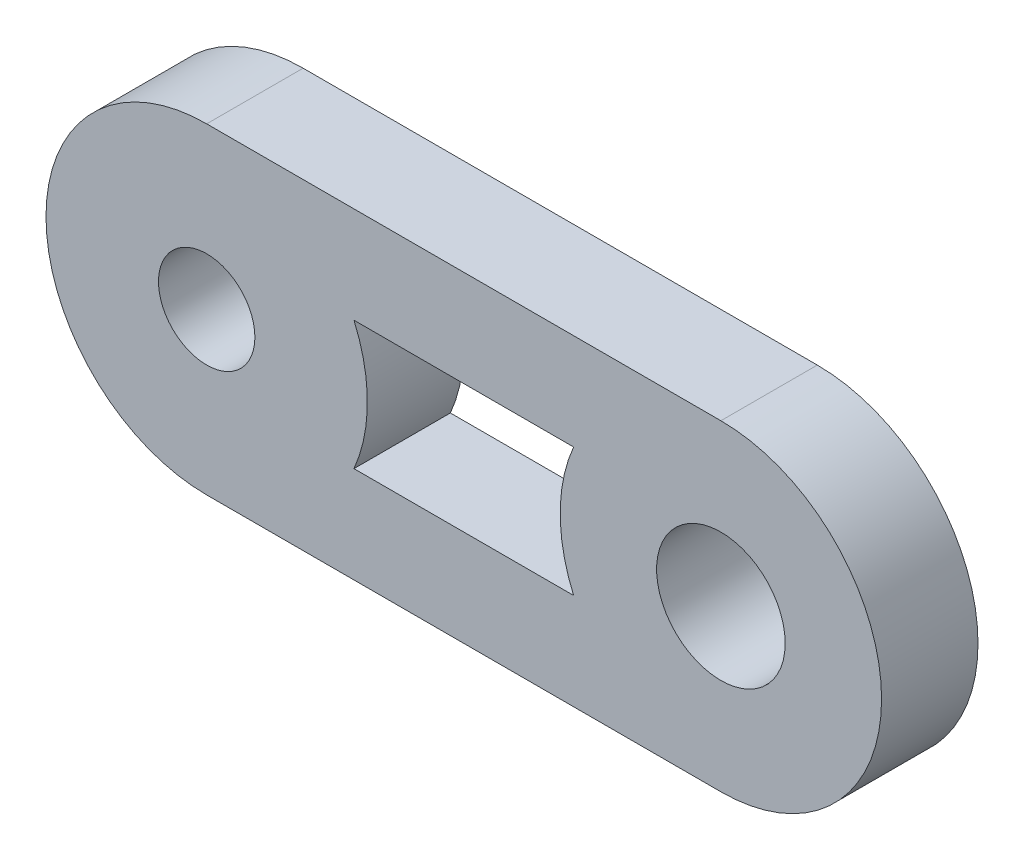
ISO-10303-21;
HEADER;
FILE_DESCRIPTION(('STEP AP214'),'2;1');
FILE_NAME('part.step','',(''),(''),'','','');
FILE_SCHEMA(('AUTOMOTIVE_DESIGN { 1 0 10303 214 1 1 1 1 }'));
ENDSEC;
DATA;
#1=APPLICATION_CONTEXT('core data for automotive mechanical design processes');
#2=APPLICATION_PROTOCOL_DEFINITION('international standard','automotive_design',2000,#1);
#3=PRODUCT_CONTEXT('',#1,'mechanical');
#4=PRODUCT('Part','Part','',(#3));
#5=PRODUCT_RELATED_PRODUCT_CATEGORY('part','',(#4));
#6=PRODUCT_DEFINITION_FORMATION('','',#4);
#7=PRODUCT_DEFINITION_CONTEXT('part definition',#1,'design');
#8=PRODUCT_DEFINITION('design','',#6,#7);
#9=PRODUCT_DEFINITION_SHAPE('','',#8);
#10=(LENGTH_UNIT() NAMED_UNIT(*) SI_UNIT(.MILLI.,.METRE.));
#11=(NAMED_UNIT(*) PLANE_ANGLE_UNIT() SI_UNIT($,.RADIAN.));
#12=(NAMED_UNIT(*) SI_UNIT($,.STERADIAN.) SOLID_ANGLE_UNIT());
#13=UNCERTAINTY_MEASURE_WITH_UNIT(LENGTH_MEASURE(1.E-05),#10,'distance_accuracy_value','');
#14=(GEOMETRIC_REPRESENTATION_CONTEXT(3) GLOBAL_UNCERTAINTY_ASSIGNED_CONTEXT((#13)) GLOBAL_UNIT_ASSIGNED_CONTEXT((#10,
#11,#12)) REPRESENTATION_CONTEXT('',''));
#15=CARTESIAN_POINT('',(0.,0.,0.));
#16=DIRECTION('',(0.,0.,1.));
#17=DIRECTION('',(1.,0.,0.));
#18=AXIS2_PLACEMENT_3D('',#15,#16,#17);
#19=CARTESIAN_POINT('',(7.99999999999999,-5.,-3.));
#20=DIRECTION('',(0.,1.,0.));
#21=DIRECTION('',(0.,0.,-1.));
#22=AXIS2_PLACEMENT_3D('',#19,#20,#21);
#23=PLANE('',#22);
#24=DIRECTION('',(1.,0.,0.));
#25=VECTOR('',#24,1.);
#26=CARTESIAN_POINT('',(7.99999999999999,-5.,0.));
#27=LINE('',#26,#25);
#28=CARTESIAN_POINT('',(0.,-5.,0.));
#29=VERTEX_POINT('',#28);
#30=CARTESIAN_POINT('',(15.9999999999999,-5.,0.));
#31=VERTEX_POINT('',#30);
#32=EDGE_CURVE('E146',#29,#31,#27,.T.);
#33=ORIENTED_EDGE('',*,*,#32,.F.);
#34=DIRECTION('',(0.,0.,1.));
#35=VECTOR('',#34,1.);
#36=CARTESIAN_POINT('',(0.,-5.,-3.));
#37=LINE('',#36,#35);
#38=CARTESIAN_POINT('',(0.,-5.,-3.));
#39=VERTEX_POINT('',#38);
#40=EDGE_CURVE('E143',#39,#29,#37,.T.);
#41=ORIENTED_EDGE('',*,*,#40,.F.);
#42=DIRECTION('',(1.,0.,0.));
#43=VECTOR('',#42,1.);
#44=CARTESIAN_POINT('',(7.99999999999999,-5.,-3.));
#45=LINE('',#44,#43);
#46=CARTESIAN_POINT('',(15.9999999999999,-5.,-3.));
#47=VERTEX_POINT('',#46);
#48=EDGE_CURVE('E132',#39,#47,#45,.T.);
#49=ORIENTED_EDGE('',*,*,#48,.T.);
#50=DIRECTION('',(0.,0.,1.));
#51=VECTOR('',#50,1.);
#52=CARTESIAN_POINT('',(15.9999999999999,-5.,-3.));
#53=LINE('',#52,#51);
#54=EDGE_CURVE('E163',#47,#31,#53,.T.);
#55=ORIENTED_EDGE('',*,*,#54,.T.);
#56=EDGE_LOOP('',(#33,#41,#49,#55));
#57=FACE_BOUND('',#56,.T.);
#58=ADVANCED_FACE('F34',(#57),#23,.F.);
#59=CARTESIAN_POINT('',(16.,0.,-3.));
#60=DIRECTION('',(0.,0.,1.));
#61=DIRECTION('',(-1.,0.,0.));
#62=AXIS2_PLACEMENT_3D('',#59,#60,#61);
#63=CYLINDRICAL_SURFACE('',#62,5.);
#64=CARTESIAN_POINT('',(16.,0.,0.));
#65=DIRECTION('',(0.,0.,1.));
#66=DIRECTION('',(1.,0.,0.));
#67=AXIS2_PLACEMENT_3D('',#64,#65,#66);
#68=CIRCLE('',#67,5.);
#69=CARTESIAN_POINT('',(15.9999999999999,5.,0.));
#70=VERTEX_POINT('',#69);
#71=EDGE_CURVE('E149',#31,#70,#68,.T.);
#72=ORIENTED_EDGE('',*,*,#71,.F.);
#73=ORIENTED_EDGE('',*,*,#54,.F.);
#74=CARTESIAN_POINT('',(16.,0.,-3.));
#75=DIRECTION('',(0.,0.,1.));
#76=DIRECTION('',(1.,0.,0.));
#77=AXIS2_PLACEMENT_3D('',#74,#75,#76);
#78=CIRCLE('',#77,5.);
#79=CARTESIAN_POINT('',(15.9999999999999,5.,-3.));
#80=VERTEX_POINT('',#79);
#81=EDGE_CURVE('E136',#47,#80,#78,.T.);
#82=ORIENTED_EDGE('',*,*,#81,.T.);
#83=DIRECTION('',(0.,0.,1.));
#84=VECTOR('',#83,1.);
#85=CARTESIAN_POINT('',(15.9999999999999,5.,-3.));
#86=LINE('',#85,#84);
#87=EDGE_CURVE('E160',#80,#70,#86,.T.);
#88=ORIENTED_EDGE('',*,*,#87,.T.);
#89=EDGE_LOOP('',(#72,#73,#82,#88));
#90=FACE_BOUND('',#89,.T.);
#91=ADVANCED_FACE('F190',(#90),#63,.T.);
#92=CARTESIAN_POINT('',(7.99999999999999,5.,-3.));
#93=DIRECTION('',(0.,1.,0.));
#94=DIRECTION('',(0.,0.,-1.));
#95=AXIS2_PLACEMENT_3D('',#92,#93,#94);
#96=PLANE('',#95);
#97=DIRECTION('',(1.,0.,0.));
#98=VECTOR('',#97,1.);
#99=CARTESIAN_POINT('',(7.99999999999999,5.,0.));
#100=LINE('',#99,#98);
#101=CARTESIAN_POINT('',(0.,5.,0.));
#102=VERTEX_POINT('',#101);
#103=EDGE_CURVE('E152',#102,#70,#100,.T.);
#104=ORIENTED_EDGE('',*,*,#103,.T.);
#105=ORIENTED_EDGE('',*,*,#87,.F.);
#106=DIRECTION('',(1.,0.,0.));
#107=VECTOR('',#106,1.);
#108=CARTESIAN_POINT('',(7.99999999999999,5.,-3.));
#109=LINE('',#108,#107);
#110=CARTESIAN_POINT('',(0.,5.,-3.));
#111=VERTEX_POINT('',#110);
#112=EDGE_CURVE('E139',#111,#80,#109,.T.);
#113=ORIENTED_EDGE('',*,*,#112,.F.);
#114=DIRECTION('',(0.,0.,1.));
#115=VECTOR('',#114,1.);
#116=CARTESIAN_POINT('',(0.,5.,-3.));
#117=LINE('',#116,#115);
#118=EDGE_CURVE('E157',#111,#102,#117,.T.);
#119=ORIENTED_EDGE('',*,*,#118,.T.);
#120=EDGE_LOOP('',(#104,#105,#113,#119));
#121=FACE_BOUND('',#120,.T.);
#122=ADVANCED_FACE('F195',(#121),#96,.T.);
#123=CARTESIAN_POINT('',(0.,0.,-3.));
#124=DIRECTION('',(0.,0.,1.));
#125=DIRECTION('',(-1.,0.,0.));
#126=AXIS2_PLACEMENT_3D('',#123,#124,#125);
#127=CYLINDRICAL_SURFACE('',#126,1.5);
#128=CARTESIAN_POINT('',(0.,0.,-3.));
#129=DIRECTION('',(0.,0.,1.));
#130=DIRECTION('',(1.,0.,0.));
#131=AXIS2_PLACEMENT_3D('',#128,#129,#130);
#132=CIRCLE('',#131,1.5);
#133=CARTESIAN_POINT('',(1.5,0.,-3.));
#134=VERTEX_POINT('',#133);
#135=EDGE_CURVE('E129',#134,#134,#132,.T.);
#136=ORIENTED_EDGE('',*,*,#135,.F.);
#137=EDGE_LOOP('',(#136));
#138=FACE_BOUND('',#137,.T.);
#139=CARTESIAN_POINT('',(0.,0.,0.));
#140=DIRECTION('',(0.,0.,1.));
#141=DIRECTION('',(1.,0.,0.));
#142=AXIS2_PLACEMENT_3D('',#139,#140,#141);
#143=CIRCLE('',#142,1.5);
#144=CARTESIAN_POINT('',(1.5,0.,0.));
#145=VERTEX_POINT('',#144);
#146=EDGE_CURVE('E126',#145,#145,#143,.T.);
#147=ORIENTED_EDGE('',*,*,#146,.T.);
#148=EDGE_LOOP('',(#147));
#149=FACE_BOUND('',#148,.T.);
#150=ADVANCED_FACE('F36',(#138,#149),#127,.F.);
#151=CARTESIAN_POINT('',(0.,0.,-3.));
#152=DIRECTION('',(0.,0.,1.));
#153=DIRECTION('',(-1.,0.,0.));
#154=AXIS2_PLACEMENT_3D('',#151,#152,#153);
#155=CYLINDRICAL_SURFACE('',#154,5.);
#156=CARTESIAN_POINT('',(0.,0.,0.));
#157=DIRECTION('',(0.,0.,1.));
#158=DIRECTION('',(1.,0.,0.));
#159=AXIS2_PLACEMENT_3D('',#156,#157,#158);
#160=CIRCLE('',#159,5.);
#161=EDGE_CURVE('E133',#29,#102,#160,.F.);
#162=ORIENTED_EDGE('',*,*,#161,.T.);
#163=ORIENTED_EDGE('',*,*,#118,.F.);
#164=CARTESIAN_POINT('',(0.,0.,-3.));
#165=DIRECTION('',(0.,0.,1.));
#166=DIRECTION('',(1.,0.,0.));
#167=AXIS2_PLACEMENT_3D('',#164,#165,#166);
#168=CIRCLE('',#167,5.);
#169=EDGE_CURVE('E141',#39,#111,#168,.F.);
#170=ORIENTED_EDGE('',*,*,#169,.F.);
#171=ORIENTED_EDGE('',*,*,#40,.T.);
#172=EDGE_LOOP('',(#162,#163,#170,#171));
#173=FACE_BOUND('',#172,.T.);
#174=ADVANCED_FACE('F203',(#173),#155,.T.);
#175=CARTESIAN_POINT('',(7.99999999999999,-21.8089085201887,-3.));
#176=DIRECTION('',(0.,0.,-1.));
#177=DIRECTION('',(1.,0.,0.));
#178=AXIS2_PLACEMENT_3D('',#175,#176,#177);
#179=PLANE('',#178);
#180=CARTESIAN_POINT('',(16.,0.,-3.));
#181=DIRECTION('',(0.,0.,1.));
#182=DIRECTION('',(1.,0.,0.));
#183=AXIS2_PLACEMENT_3D('',#180,#181,#182);
#184=CIRCLE('',#183,2.);
#185=CARTESIAN_POINT('',(18.,0.,-3.));
#186=VERTEX_POINT('',#185);
#187=EDGE_CURVE('E212',#186,#186,#184,.T.);
#188=ORIENTED_EDGE('',*,*,#187,.T.);
#189=EDGE_LOOP('',(#188));
#190=FACE_BOUND('',#189,.T.);
#191=CARTESIAN_POINT('',(16.,0.,-3.));
#192=DIRECTION('',(0.,0.,-1.));
#193=DIRECTION('',(1.,0.,0.));
#194=AXIS2_PLACEMENT_3D('',#191,#192,#193);
#195=CIRCLE('',#194,5.);
#196=CARTESIAN_POINT('',(11.4174243050441,-2.,-3.));
#197=VERTEX_POINT('',#196);
#198=CARTESIAN_POINT('',(11.4174243050441,2.,-3.));
#199=VERTEX_POINT('',#198);
#200=EDGE_CURVE('E118',#197,#199,#195,.T.);
#201=ORIENTED_EDGE('',*,*,#200,.T.);
#202=DIRECTION('',(-1.,0.,0.));
#203=VECTOR('',#202,1.);
#204=CARTESIAN_POINT('',(11.4174243050441,2.,-3.));
#205=LINE('',#204,#203);
#206=CARTESIAN_POINT('',(4.58257569495584,2.,-3.));
#207=VERTEX_POINT('',#206);
#208=EDGE_CURVE('E101',#199,#207,#205,.T.);
#209=ORIENTED_EDGE('',*,*,#208,.T.);
#210=CARTESIAN_POINT('',(0.,0.,-3.));
#211=DIRECTION('',(0.,0.,-1.));
#212=DIRECTION('',(1.,0.,0.));
#213=AXIS2_PLACEMENT_3D('',#210,#211,#212);
#214=CIRCLE('',#213,5.);
#215=CARTESIAN_POINT('',(4.58257569495584,-2.,-3.));
#216=VERTEX_POINT('',#215);
#217=EDGE_CURVE('E109',#207,#216,#214,.T.);
#218=ORIENTED_EDGE('',*,*,#217,.T.);
#219=DIRECTION('',(1.,0.,0.));
#220=VECTOR('',#219,1.);
#221=CARTESIAN_POINT('',(4.58257569495584,-2.,-3.));
#222=LINE('',#221,#220);
#223=EDGE_CURVE('E114',#216,#197,#222,.T.);
#224=ORIENTED_EDGE('',*,*,#223,.T.);
#225=EDGE_LOOP('',(#201,#209,#218,#224));
#226=FACE_BOUND('',#225,.T.);
#227=ORIENTED_EDGE('',*,*,#135,.T.);
#228=EDGE_LOOP('',(#227));
#229=FACE_BOUND('',#228,.T.);
#230=ORIENTED_EDGE('',*,*,#48,.F.);
#231=ORIENTED_EDGE('',*,*,#169,.T.);
#232=ORIENTED_EDGE('',*,*,#112,.T.);
#233=ORIENTED_EDGE('',*,*,#81,.F.);
#234=EDGE_LOOP('',(#230,#231,#232,#233));
#235=FACE_BOUND('',#234,.T.);
#236=ADVANCED_FACE('F116',(#190,#226,#229,#235),#179,.T.);
#237=CARTESIAN_POINT('',(7.99999999999999,-21.8089085201887,0.));
#238=DIRECTION('',(0.,0.,-1.));
#239=DIRECTION('',(1.,0.,0.));
#240=AXIS2_PLACEMENT_3D('',#237,#238,#239);
#241=PLANE('',#240);
#242=CARTESIAN_POINT('',(16.,0.,0.));
#243=DIRECTION('',(0.,0.,1.));
#244=DIRECTION('',(1.,0.,0.));
#245=AXIS2_PLACEMENT_3D('',#242,#243,#244);
#246=CIRCLE('',#245,2.);
#247=CARTESIAN_POINT('',(18.,0.,0.));
#248=VERTEX_POINT('',#247);
#249=EDGE_CURVE('E38',#248,#248,#246,.T.);
#250=ORIENTED_EDGE('',*,*,#249,.F.);
#251=EDGE_LOOP('',(#250));
#252=FACE_BOUND('',#251,.T.);
#253=DIRECTION('',(1.,0.,0.));
#254=VECTOR('',#253,1.);
#255=CARTESIAN_POINT('',(7.99999999999999,-2.,0.));
#256=LINE('',#255,#254);
#257=CARTESIAN_POINT('',(4.58257569495584,-2.,0.));
#258=VERTEX_POINT('',#257);
#259=CARTESIAN_POINT('',(11.4174243050441,-2.,0.));
#260=VERTEX_POINT('',#259);
#261=EDGE_CURVE('E43',#258,#260,#256,.T.);
#262=ORIENTED_EDGE('',*,*,#261,.F.);
#263=CARTESIAN_POINT('',(0.,0.,0.));
#264=DIRECTION('',(0.,0.,1.));
#265=DIRECTION('',(1.,0.,0.));
#266=AXIS2_PLACEMENT_3D('',#263,#264,#265);
#267=CIRCLE('',#266,5.);
#268=CARTESIAN_POINT('',(4.58257569495584,2.,0.));
#269=VERTEX_POINT('',#268);
#270=EDGE_CURVE('E167',#269,#258,#267,.F.);
#271=ORIENTED_EDGE('',*,*,#270,.F.);
#272=DIRECTION('',(-1.,0.,0.));
#273=VECTOR('',#272,1.);
#274=CARTESIAN_POINT('',(7.99999999999999,2.,0.));
#275=LINE('',#274,#273);
#276=CARTESIAN_POINT('',(11.4174243050441,2.,0.));
#277=VERTEX_POINT('',#276);
#278=EDGE_CURVE('E104',#277,#269,#275,.T.);
#279=ORIENTED_EDGE('',*,*,#278,.F.);
#280=CARTESIAN_POINT('',(16.,0.,0.));
#281=DIRECTION('',(0.,0.,1.));
#282=DIRECTION('',(1.,0.,0.));
#283=AXIS2_PLACEMENT_3D('',#280,#281,#282);
#284=CIRCLE('',#283,5.);
#285=EDGE_CURVE('E11',#260,#277,#284,.F.);
#286=ORIENTED_EDGE('',*,*,#285,.F.);
#287=EDGE_LOOP('',(#262,#271,#279,#286));
#288=FACE_BOUND('',#287,.T.);
#289=ORIENTED_EDGE('',*,*,#146,.F.);
#290=EDGE_LOOP('',(#289));
#291=FACE_BOUND('',#290,.T.);
#292=ORIENTED_EDGE('',*,*,#32,.T.);
#293=ORIENTED_EDGE('',*,*,#71,.T.);
#294=ORIENTED_EDGE('',*,*,#103,.F.);
#295=ORIENTED_EDGE('',*,*,#161,.F.);
#296=EDGE_LOOP('',(#292,#293,#294,#295));
#297=FACE_BOUND('',#296,.T.);
#298=ADVANCED_FACE('F175',(#252,#288,#291,#297),#241,.F.);
#299=CARTESIAN_POINT('',(16.,0.,7.));
#300=DIRECTION('',(0.,0.,-1.));
#301=DIRECTION('',(1.,0.,0.));
#302=AXIS2_PLACEMENT_3D('',#299,#300,#301);
#303=CYLINDRICAL_SURFACE('',#302,5.);
#304=DIRECTION('',(0.,0.,-1.));
#305=VECTOR('',#304,1.);
#306=CARTESIAN_POINT('',(11.4174243050441,-2.,7.));
#307=LINE('',#306,#305);
#308=EDGE_CURVE('E124',#260,#197,#307,.T.);
#309=ORIENTED_EDGE('',*,*,#308,.F.);
#310=ORIENTED_EDGE('',*,*,#285,.T.);
#311=DIRECTION('',(0.,0.,-1.));
#312=VECTOR('',#311,1.);
#313=CARTESIAN_POINT('',(11.4174243050441,2.,7.));
#314=LINE('',#313,#312);
#315=EDGE_CURVE('E49',#277,#199,#314,.T.);
#316=ORIENTED_EDGE('',*,*,#315,.T.);
#317=ORIENTED_EDGE('',*,*,#200,.F.);
#318=EDGE_LOOP('',(#309,#310,#316,#317));
#319=FACE_BOUND('',#318,.T.);
#320=ADVANCED_FACE('F177',(#319),#303,.T.);
#321=CARTESIAN_POINT('',(4.58257569495584,-2.,7.));
#322=DIRECTION('',(0.,-1.,0.));
#323=DIRECTION('',(0.,0.,1.));
#324=AXIS2_PLACEMENT_3D('',#321,#322,#323);
#325=PLANE('',#324);
#326=DIRECTION('',(0.,0.,-1.));
#327=VECTOR('',#326,1.);
#328=CARTESIAN_POINT('',(4.58257569495584,-2.,7.));
#329=LINE('',#328,#327);
#330=EDGE_CURVE('E106',#258,#216,#329,.T.);
#331=ORIENTED_EDGE('',*,*,#330,.F.);
#332=ORIENTED_EDGE('',*,*,#261,.T.);
#333=ORIENTED_EDGE('',*,*,#308,.T.);
#334=ORIENTED_EDGE('',*,*,#223,.F.);
#335=EDGE_LOOP('',(#331,#332,#333,#334));
#336=FACE_BOUND('',#335,.T.);
#337=ADVANCED_FACE('F172',(#336),#325,.F.);
#338=CARTESIAN_POINT('',(0.,0.,7.));
#339=DIRECTION('',(0.,0.,-1.));
#340=DIRECTION('',(1.,0.,0.));
#341=AXIS2_PLACEMENT_3D('',#338,#339,#340);
#342=CYLINDRICAL_SURFACE('',#341,5.);
#343=DIRECTION('',(0.,0.,-1.));
#344=VECTOR('',#343,1.);
#345=CARTESIAN_POINT('',(4.58257569495584,2.,7.));
#346=LINE('',#345,#344);
#347=EDGE_CURVE('E57',#269,#207,#346,.T.);
#348=ORIENTED_EDGE('',*,*,#347,.F.);
#349=ORIENTED_EDGE('',*,*,#270,.T.);
#350=ORIENTED_EDGE('',*,*,#330,.T.);
#351=ORIENTED_EDGE('',*,*,#217,.F.);
#352=EDGE_LOOP('',(#348,#349,#350,#351));
#353=FACE_BOUND('',#352,.T.);
#354=ADVANCED_FACE('F110',(#353),#342,.T.);
#355=CARTESIAN_POINT('',(11.4174243050441,2.,7.));
#356=DIRECTION('',(0.,1.,0.));
#357=DIRECTION('',(0.,0.,-1.));
#358=AXIS2_PLACEMENT_3D('',#355,#356,#357);
#359=PLANE('',#358);
#360=ORIENTED_EDGE('',*,*,#315,.F.);
#361=ORIENTED_EDGE('',*,*,#278,.T.);
#362=ORIENTED_EDGE('',*,*,#347,.T.);
#363=ORIENTED_EDGE('',*,*,#208,.F.);
#364=EDGE_LOOP('',(#360,#361,#362,#363));
#365=FACE_BOUND('',#364,.T.);
#366=ADVANCED_FACE('F99',(#365),#359,.F.);
#367=CARTESIAN_POINT('',(16.,0.,7.));
#368=DIRECTION('',(0.,0.,-1.));
#369=DIRECTION('',(1.,0.,0.));
#370=AXIS2_PLACEMENT_3D('',#367,#368,#369);
#371=CYLINDRICAL_SURFACE('',#370,2.);
#372=ORIENTED_EDGE('',*,*,#187,.F.);
#373=EDGE_LOOP('',(#372));
#374=FACE_BOUND('',#373,.T.);
#375=ORIENTED_EDGE('',*,*,#249,.T.);
#376=EDGE_LOOP('',(#375));
#377=FACE_BOUND('',#376,.T.);
#378=ADVANCED_FACE('F217',(#374,#377),#371,.F.);
#379=CLOSED_SHELL('',(#58,#91,#122,#150,#174,#236,#298,#320,#337,#354,#366,#378));
#380=MANIFOLD_SOLID_BREP('B2',#379);
#381=ADVANCED_BREP_SHAPE_REPRESENTATION('',(#18,#380),#14);
#382=SHAPE_DEFINITION_REPRESENTATION(#9,#381);
ENDSEC;
END-ISO-10303-21;
